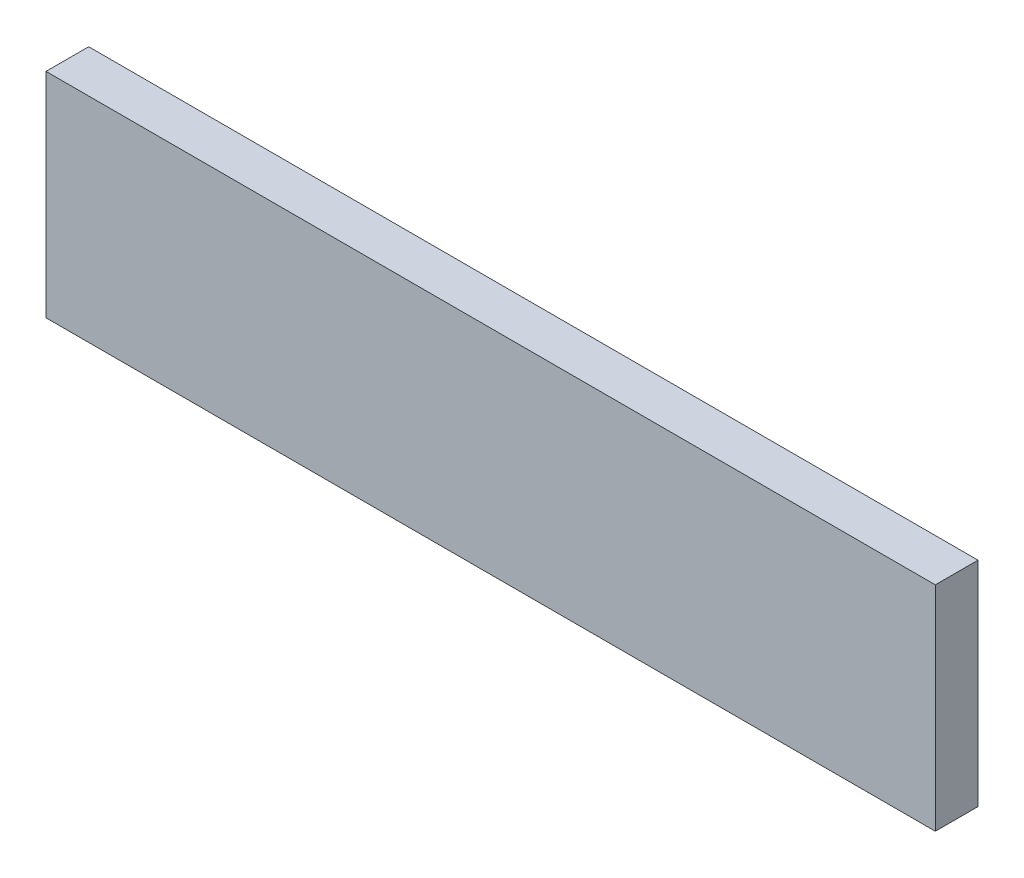
ISO-10303-21;
HEADER;
FILE_DESCRIPTION(('STEP AP214'),'2;1');
FILE_NAME('part.step','',(''),(''),'','','');
FILE_SCHEMA(('AUTOMOTIVE_DESIGN { 1 0 10303 214 1 1 1 1 }'));
ENDSEC;
DATA;
#1=APPLICATION_CONTEXT('core data for automotive mechanical design processes');
#2=APPLICATION_PROTOCOL_DEFINITION('international standard','automotive_design',2000,#1);
#3=PRODUCT_CONTEXT('',#1,'mechanical');
#4=PRODUCT('Part','Part','',(#3));
#5=PRODUCT_RELATED_PRODUCT_CATEGORY('part','',(#4));
#6=PRODUCT_DEFINITION_FORMATION('','',#4);
#7=PRODUCT_DEFINITION_CONTEXT('part definition',#1,'design');
#8=PRODUCT_DEFINITION('design','',#6,#7);
#9=PRODUCT_DEFINITION_SHAPE('','',#8);
#10=(LENGTH_UNIT() NAMED_UNIT(*) SI_UNIT(.MILLI.,.METRE.));
#11=(NAMED_UNIT(*) PLANE_ANGLE_UNIT() SI_UNIT($,.RADIAN.));
#12=(NAMED_UNIT(*) SI_UNIT($,.STERADIAN.) SOLID_ANGLE_UNIT());
#13=UNCERTAINTY_MEASURE_WITH_UNIT(LENGTH_MEASURE(1.E-05),#10,'distance_accuracy_value','');
#14=(GEOMETRIC_REPRESENTATION_CONTEXT(3) GLOBAL_UNCERTAINTY_ASSIGNED_CONTEXT((#13)) GLOBAL_UNIT_ASSIGNED_CONTEXT((#10,
#11,#12)) REPRESENTATION_CONTEXT('',''));
#15=CARTESIAN_POINT('',(0.,0.,0.));
#16=DIRECTION('',(0.,0.,1.));
#17=DIRECTION('',(1.,0.,0.));
#18=AXIS2_PLACEMENT_3D('',#15,#16,#17);
#19=CARTESIAN_POINT('',(-41.7553191489362,12.854609929078,1.2));
#20=DIRECTION('',(1.,0.,0.));
#21=DIRECTION('',(0.,0.,-1.));
#22=AXIS2_PLACEMENT_3D('',#19,#20,#21);
#23=PLANE('',#22);
#24=DIRECTION('',(0.,-1.,0.));
#25=VECTOR('',#24,1.);
#26=CARTESIAN_POINT('',(-41.7553191489362,12.854609929078,0.));
#27=LINE('',#26,#25);
#28=CARTESIAN_POINT('',(-41.7553191489362,12.854609929078,0.));
#29=VERTEX_POINT('',#28);
#30=CARTESIAN_POINT('',(-41.7553191489362,6.85460992907801,0.));
#31=VERTEX_POINT('',#30);
#32=EDGE_CURVE('E96',#29,#31,#27,.T.);
#33=ORIENTED_EDGE('',*,*,#32,.T.);
#34=DIRECTION('',(0.,0.,-1.));
#35=VECTOR('',#34,1.);
#36=CARTESIAN_POINT('',(-41.7553191489362,6.85460992907801,1.2));
#37=LINE('',#36,#35);
#38=CARTESIAN_POINT('',(-41.7553191489362,6.85460992907801,1.2));
#39=VERTEX_POINT('',#38);
#40=EDGE_CURVE('E11',#39,#31,#37,.T.);
#41=ORIENTED_EDGE('',*,*,#40,.F.);
#42=DIRECTION('',(0.,-1.,0.));
#43=VECTOR('',#42,1.);
#44=CARTESIAN_POINT('',(-41.7553191489362,12.854609929078,1.2));
#45=LINE('',#44,#43);
#46=CARTESIAN_POINT('',(-41.7553191489362,12.854609929078,1.2));
#47=VERTEX_POINT('',#46);
#48=EDGE_CURVE('E84',#47,#39,#45,.T.);
#49=ORIENTED_EDGE('',*,*,#48,.F.);
#50=DIRECTION('',(0.,0.,-1.));
#51=VECTOR('',#50,1.);
#52=CARTESIAN_POINT('',(-41.7553191489362,12.854609929078,1.2));
#53=LINE('',#52,#51);
#54=EDGE_CURVE('E92',#47,#29,#53,.T.);
#55=ORIENTED_EDGE('',*,*,#54,.T.);
#56=EDGE_LOOP('',(#33,#41,#49,#55));
#57=FACE_BOUND('',#56,.T.);
#58=ADVANCED_FACE('F33',(#57),#23,.F.);
#59=CARTESIAN_POINT('',(-41.7553191489362,6.85460992907801,1.2));
#60=DIRECTION('',(0.,1.,0.));
#61=DIRECTION('',(0.,0.,1.));
#62=AXIS2_PLACEMENT_3D('',#59,#60,#61);
#63=PLANE('',#62);
#64=DIRECTION('',(1.,0.,0.));
#65=VECTOR('',#64,1.);
#66=CARTESIAN_POINT('',(-41.7553191489362,6.85460992907801,0.));
#67=LINE('',#66,#65);
#68=CARTESIAN_POINT('',(-16.7553191489362,6.85460992907801,0.));
#69=VERTEX_POINT('',#68);
#70=EDGE_CURVE('E88',#31,#69,#67,.T.);
#71=ORIENTED_EDGE('',*,*,#70,.T.);
#72=DIRECTION('',(0.,0.,-1.));
#73=VECTOR('',#72,1.);
#74=CARTESIAN_POINT('',(-16.7553191489362,6.85460992907801,1.2));
#75=LINE('',#74,#73);
#76=CARTESIAN_POINT('',(-16.7553191489362,6.85460992907801,1.2));
#77=VERTEX_POINT('',#76);
#78=EDGE_CURVE('E41',#77,#69,#75,.T.);
#79=ORIENTED_EDGE('',*,*,#78,.F.);
#80=DIRECTION('',(1.,0.,0.));
#81=VECTOR('',#80,1.);
#82=CARTESIAN_POINT('',(-41.7553191489362,6.85460992907801,1.2));
#83=LINE('',#82,#81);
#84=EDGE_CURVE('E79',#39,#77,#83,.T.);
#85=ORIENTED_EDGE('',*,*,#84,.F.);
#86=ORIENTED_EDGE('',*,*,#40,.T.);
#87=EDGE_LOOP('',(#71,#79,#85,#86));
#88=FACE_BOUND('',#87,.T.);
#89=ADVANCED_FACE('F87',(#88),#63,.F.);
#90=CARTESIAN_POINT('',(-16.7553191489362,12.854609929078,1.2));
#91=DIRECTION('',(-1.,0.,0.));
#92=DIRECTION('',(0.,-1.,0.));
#93=AXIS2_PLACEMENT_3D('',#90,#91,#92);
#94=PLANE('',#93);
#95=DIRECTION('',(0.,1.,0.));
#96=VECTOR('',#95,1.);
#97=CARTESIAN_POINT('',(-16.7553191489362,12.854609929078,0.));
#98=LINE('',#97,#96);
#99=CARTESIAN_POINT('',(-16.7553191489362,12.854609929078,0.));
#100=VERTEX_POINT('',#99);
#101=EDGE_CURVE('E66',#69,#100,#98,.T.);
#102=ORIENTED_EDGE('',*,*,#101,.T.);
#103=DIRECTION('',(0.,0.,-1.));
#104=VECTOR('',#103,1.);
#105=CARTESIAN_POINT('',(-16.7553191489362,12.854609929078,1.2));
#106=LINE('',#105,#104);
#107=CARTESIAN_POINT('',(-16.7553191489362,12.854609929078,1.2));
#108=VERTEX_POINT('',#107);
#109=EDGE_CURVE('E89',#108,#100,#106,.T.);
#110=ORIENTED_EDGE('',*,*,#109,.F.);
#111=DIRECTION('',(0.,1.,0.));
#112=VECTOR('',#111,1.);
#113=CARTESIAN_POINT('',(-16.7553191489362,12.854609929078,1.2));
#114=LINE('',#113,#112);
#115=EDGE_CURVE('E82',#77,#108,#114,.T.);
#116=ORIENTED_EDGE('',*,*,#115,.F.);
#117=ORIENTED_EDGE('',*,*,#78,.T.);
#118=EDGE_LOOP('',(#102,#110,#116,#117));
#119=FACE_BOUND('',#118,.T.);
#120=ADVANCED_FACE('F90',(#119),#94,.F.);
#121=CARTESIAN_POINT('',(-41.7553191489362,12.854609929078,1.2));
#122=DIRECTION('',(0.,-1.,0.));
#123=DIRECTION('',(0.,0.,-1.));
#124=AXIS2_PLACEMENT_3D('',#121,#122,#123);
#125=PLANE('',#124);
#126=DIRECTION('',(-1.,0.,0.));
#127=VECTOR('',#126,1.);
#128=CARTESIAN_POINT('',(-41.7553191489362,12.854609929078,0.));
#129=LINE('',#128,#127);
#130=EDGE_CURVE('E72',#100,#29,#129,.T.);
#131=ORIENTED_EDGE('',*,*,#130,.T.);
#132=ORIENTED_EDGE('',*,*,#54,.F.);
#133=DIRECTION('',(-1.,0.,0.));
#134=VECTOR('',#133,1.);
#135=CARTESIAN_POINT('',(-41.7553191489362,12.854609929078,1.2));
#136=LINE('',#135,#134);
#137=EDGE_CURVE('E49',#108,#47,#136,.T.);
#138=ORIENTED_EDGE('',*,*,#137,.F.);
#139=ORIENTED_EDGE('',*,*,#109,.T.);
#140=EDGE_LOOP('',(#131,#132,#138,#139));
#141=FACE_BOUND('',#140,.T.);
#142=ADVANCED_FACE('F103',(#141),#125,.F.);
#143=CARTESIAN_POINT('',(0.,0.,1.2));
#144=DIRECTION('',(0.,0.,1.));
#145=DIRECTION('',(1.,0.,0.));
#146=AXIS2_PLACEMENT_3D('',#143,#144,#145);
#147=PLANE('',#146);
#148=ORIENTED_EDGE('',*,*,#48,.T.);
#149=ORIENTED_EDGE('',*,*,#84,.T.);
#150=ORIENTED_EDGE('',*,*,#115,.T.);
#151=ORIENTED_EDGE('',*,*,#137,.T.);
#152=EDGE_LOOP('',(#148,#149,#150,#151));
#153=FACE_BOUND('',#152,.T.);
#154=ADVANCED_FACE('F80',(#153),#147,.T.);
#155=CARTESIAN_POINT('',(0.,0.,0.));
#156=DIRECTION('',(0.,0.,1.));
#157=DIRECTION('',(1.,0.,0.));
#158=AXIS2_PLACEMENT_3D('',#155,#156,#157);
#159=PLANE('',#158);
#160=ORIENTED_EDGE('',*,*,#32,.F.);
#161=ORIENTED_EDGE('',*,*,#130,.F.);
#162=ORIENTED_EDGE('',*,*,#101,.F.);
#163=ORIENTED_EDGE('',*,*,#70,.F.);
#164=EDGE_LOOP('',(#160,#161,#162,#163));
#165=FACE_BOUND('',#164,.T.);
#166=ADVANCED_FACE('F106',(#165),#159,.F.);
#167=CLOSED_SHELL('',(#58,#89,#120,#142,#154,#166));
#168=MANIFOLD_SOLID_BREP('B2',#167);
#169=ADVANCED_BREP_SHAPE_REPRESENTATION('',(#18,#168),#14);
#170=SHAPE_DEFINITION_REPRESENTATION(#9,#169);
ENDSEC;
END-ISO-10303-21;
